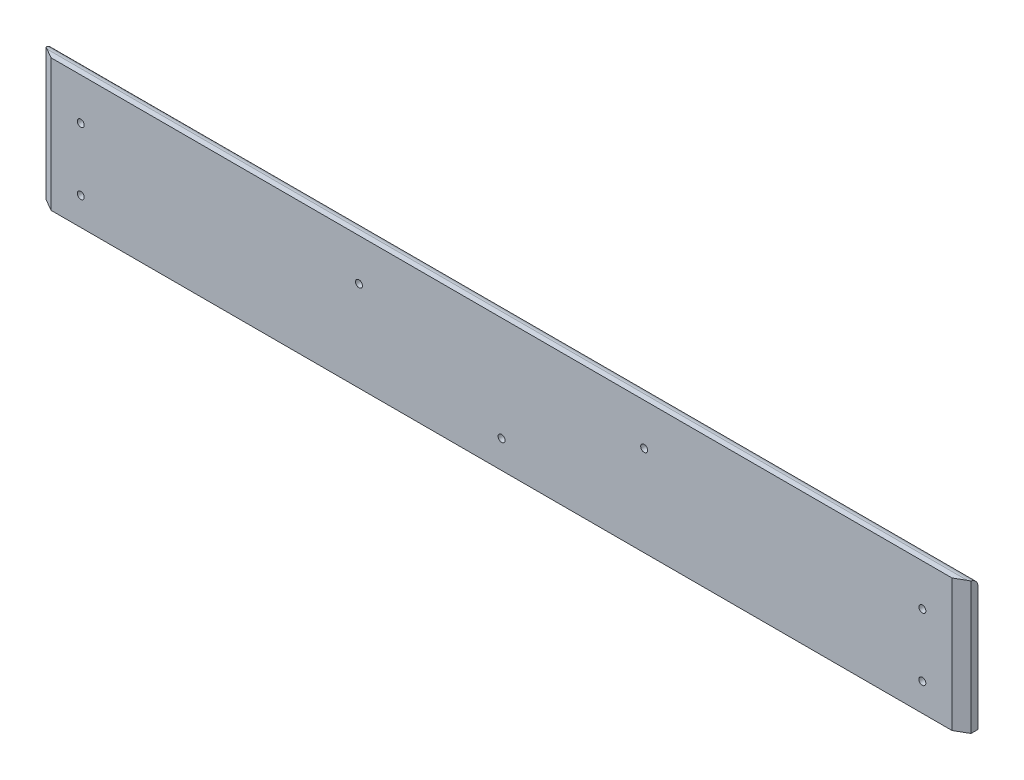
ISO-10303-21;
HEADER;
FILE_DESCRIPTION(('STEP AP214'),'2;1');
FILE_NAME('part.step','',(''),(''),'','','');
FILE_SCHEMA(('AUTOMOTIVE_DESIGN { 1 0 10303 214 1 1 1 1 }'));
ENDSEC;
DATA;
#1=APPLICATION_CONTEXT('core data for automotive mechanical design processes');
#2=APPLICATION_PROTOCOL_DEFINITION('international standard','automotive_design',2000,#1);
#3=PRODUCT_CONTEXT('',#1,'mechanical');
#4=PRODUCT('Part','Part','',(#3));
#5=PRODUCT_RELATED_PRODUCT_CATEGORY('part','',(#4));
#6=PRODUCT_DEFINITION_FORMATION('','',#4);
#7=PRODUCT_DEFINITION_CONTEXT('part definition',#1,'design');
#8=PRODUCT_DEFINITION('design','',#6,#7);
#9=PRODUCT_DEFINITION_SHAPE('','',#8);
#10=(LENGTH_UNIT() NAMED_UNIT(*) SI_UNIT(.MILLI.,.METRE.));
#11=(NAMED_UNIT(*) PLANE_ANGLE_UNIT() SI_UNIT($,.RADIAN.));
#12=(NAMED_UNIT(*) SI_UNIT($,.STERADIAN.) SOLID_ANGLE_UNIT());
#13=UNCERTAINTY_MEASURE_WITH_UNIT(LENGTH_MEASURE(1.E-05),#10,'distance_accuracy_value','');
#14=(GEOMETRIC_REPRESENTATION_CONTEXT(3) GLOBAL_UNCERTAINTY_ASSIGNED_CONTEXT((#13)) GLOBAL_UNIT_ASSIGNED_CONTEXT((#10,
#11,#12)) REPRESENTATION_CONTEXT('',''));
#15=CARTESIAN_POINT('',(0.,0.,0.));
#16=DIRECTION('',(0.,0.,1.));
#17=DIRECTION('',(1.,0.,0.));
#18=AXIS2_PLACEMENT_3D('',#15,#16,#17);
#19=CARTESIAN_POINT('',(332.5,-47.4999999999999,5.));
#20=DIRECTION('',(-1.,0.,0.));
#21=DIRECTION('',(0.,0.,1.));
#22=AXIS2_PLACEMENT_3D('',#19,#20,#21);
#23=PLANE('',#22);
#24=CARTESIAN_POINT('',(332.5,41.4999999999999,1.));
#25=DIRECTION('',(-1.,0.,0.));
#26=DIRECTION('',(0.,0.,1.));
#27=AXIS2_PLACEMENT_3D('',#24,#25,#26);
#28=CIRCLE('',#27,6.);
#29=CARTESIAN_POINT('',(332.5,41.4999999999999,-5.));
#30=VERTEX_POINT('',#29);
#31=CARTESIAN_POINT('',(332.5,47.4160797830995,0.));
#32=VERTEX_POINT('',#31);
#33=EDGE_CURVE('E156',#30,#32,#28,.F.);
#34=ORIENTED_EDGE('',*,*,#33,.T.);
#35=DIRECTION('',(0.,-1.,0.));
#36=VECTOR('',#35,1.);
#37=CARTESIAN_POINT('',(332.5,-47.4999999999999,0.));
#38=LINE('',#37,#36);
#39=CARTESIAN_POINT('',(332.5,-47.4999999999999,0.));
#40=VERTEX_POINT('',#39);
#41=EDGE_CURVE('E77',#32,#40,#38,.T.);
#42=ORIENTED_EDGE('',*,*,#41,.T.);
#43=DIRECTION('',(0.,0.,-1.));
#44=VECTOR('',#43,1.);
#45=CARTESIAN_POINT('',(332.5,-47.4999999999999,5.));
#46=LINE('',#45,#44);
#47=CARTESIAN_POINT('',(332.5,-47.4999999999999,-5.));
#48=VERTEX_POINT('',#47);
#49=EDGE_CURVE('E122',#40,#48,#46,.T.);
#50=ORIENTED_EDGE('',*,*,#49,.T.);
#51=DIRECTION('',(0.,1.,0.));
#52=VECTOR('',#51,1.);
#53=CARTESIAN_POINT('',(332.5,-47.4999999999999,-5.));
#54=LINE('',#53,#52);
#55=EDGE_CURVE('E132',#48,#30,#54,.T.);
#56=ORIENTED_EDGE('',*,*,#55,.T.);
#57=EDGE_LOOP('',(#34,#42,#50,#56));
#58=FACE_BOUND('',#57,.T.);
#59=ADVANCED_FACE('F52',(#58),#23,.F.);
#60=CARTESIAN_POINT('',(-332.5,47.4999999999998,5.));
#61=DIRECTION('',(0.,-1.,0.));
#62=DIRECTION('',(1.,0.,0.));
#63=AXIS2_PLACEMENT_3D('',#60,#61,#62);
#64=PLANE('',#63);
#65=DIRECTION('',(-1.,0.,0.));
#66=VECTOR('',#65,1.);
#67=CARTESIAN_POINT('',(-332.5,47.4999999999998,5.));
#68=LINE('',#67,#66);
#69=CARTESIAN_POINT('',(323.839745962156,47.4999999999999,5.));
#70=VERTEX_POINT('',#69);
#71=CARTESIAN_POINT('',(-323.839745962156,47.4999999999998,5.));
#72=VERTEX_POINT('',#71);
#73=EDGE_CURVE('E137',#70,#72,#68,.T.);
#74=ORIENTED_EDGE('',*,*,#73,.F.);
#75=DIRECTION('',(-0.866025403784439,0.,0.499999999999999));
#76=VECTOR('',#75,1.);
#77=CARTESIAN_POINT('',(323.839745962156,47.4999999999999,5.));
#78=LINE('',#77,#76);
#79=CARTESIAN_POINT('',(330.767949192431,47.4999999999999,1.));
#80=VERTEX_POINT('',#79);
#81=EDGE_CURVE('E170',#70,#80,#78,.F.);
#82=ORIENTED_EDGE('',*,*,#81,.T.);
#83=DIRECTION('',(-1.,0.,0.));
#84=VECTOR('',#83,1.);
#85=CARTESIAN_POINT('',(-332.5,47.4999999999998,1.));
#86=LINE('',#85,#84);
#87=CARTESIAN_POINT('',(-330.767949192431,47.4999999999998,1.));
#88=VERTEX_POINT('',#87);
#89=EDGE_CURVE('E121',#80,#88,#86,.T.);
#90=ORIENTED_EDGE('',*,*,#89,.T.);
#91=DIRECTION('',(-0.866025403784439,0.,-0.499999999999999));
#92=VECTOR('',#91,1.);
#93=CARTESIAN_POINT('',(-323.839745962156,47.4999999999998,5.));
#94=LINE('',#93,#92);
#95=EDGE_CURVE('E167',#88,#72,#94,.F.);
#96=ORIENTED_EDGE('',*,*,#95,.T.);
#97=EDGE_LOOP('',(#74,#82,#90,#96));
#98=FACE_BOUND('',#97,.T.);
#99=ADVANCED_FACE('F264',(#98),#64,.F.);
#100=CARTESIAN_POINT('',(-332.5,-47.5,5.));
#101=DIRECTION('',(1.,0.,0.));
#102=DIRECTION('',(0.,0.,-1.));
#103=AXIS2_PLACEMENT_3D('',#100,#101,#102);
#104=PLANE('',#103);
#105=DIRECTION('',(0.,0.,-1.));
#106=VECTOR('',#105,1.);
#107=CARTESIAN_POINT('',(-332.5,-47.5,5.));
#108=LINE('',#107,#106);
#109=CARTESIAN_POINT('',(-332.5,-47.5,0.));
#110=VERTEX_POINT('',#109);
#111=CARTESIAN_POINT('',(-332.5,-47.5,-5.));
#112=VERTEX_POINT('',#111);
#113=EDGE_CURVE('E112',#110,#112,#108,.T.);
#114=ORIENTED_EDGE('',*,*,#113,.F.);
#115=DIRECTION('',(0.,1.,0.));
#116=VECTOR('',#115,1.);
#117=CARTESIAN_POINT('',(-332.5,-47.5,0.));
#118=LINE('',#117,#116);
#119=CARTESIAN_POINT('',(-332.5,47.4160797830995,0.));
#120=VERTEX_POINT('',#119);
#121=EDGE_CURVE('E186',#110,#120,#118,.T.);
#122=ORIENTED_EDGE('',*,*,#121,.T.);
#123=CARTESIAN_POINT('',(-332.5,41.4999999999998,1.));
#124=DIRECTION('',(1.,0.,0.));
#125=DIRECTION('',(0.,0.,-1.));
#126=AXIS2_PLACEMENT_3D('',#123,#124,#125);
#127=CIRCLE('',#126,6.);
#128=CARTESIAN_POINT('',(-332.5,41.4999999999998,-5.));
#129=VERTEX_POINT('',#128);
#130=EDGE_CURVE('E128',#120,#129,#127,.F.);
#131=ORIENTED_EDGE('',*,*,#130,.T.);
#132=DIRECTION('',(0.,-1.,0.));
#133=VECTOR('',#132,1.);
#134=CARTESIAN_POINT('',(-332.5,-47.5,-5.));
#135=LINE('',#134,#133);
#136=EDGE_CURVE('E125',#129,#112,#135,.T.);
#137=ORIENTED_EDGE('',*,*,#136,.T.);
#138=EDGE_LOOP('',(#114,#122,#131,#137));
#139=FACE_BOUND('',#138,.T.);
#140=ADVANCED_FACE('F126',(#139),#104,.F.);
#141=CARTESIAN_POINT('',(-332.5,-47.5,5.));
#142=DIRECTION('',(0.,1.,0.));
#143=DIRECTION('',(-1.,0.,0.));
#144=AXIS2_PLACEMENT_3D('',#141,#142,#143);
#145=PLANE('',#144);
#146=ORIENTED_EDGE('',*,*,#49,.F.);
#147=DIRECTION('',(0.866025403784439,0.,-0.499999999999999));
#148=VECTOR('',#147,1.);
#149=CARTESIAN_POINT('',(323.839745962156,-47.4999999999999,5.));
#150=LINE('',#149,#148);
#151=CARTESIAN_POINT('',(323.839745962156,-47.4999999999999,5.));
#152=VERTEX_POINT('',#151);
#153=EDGE_CURVE('E183',#40,#152,#150,.F.);
#154=ORIENTED_EDGE('',*,*,#153,.T.);
#155=DIRECTION('',(1.,0.,0.));
#156=VECTOR('',#155,1.);
#157=CARTESIAN_POINT('',(-332.5,-47.5,5.));
#158=LINE('',#157,#156);
#159=CARTESIAN_POINT('',(-323.839745962156,-47.5,5.));
#160=VERTEX_POINT('',#159);
#161=EDGE_CURVE('E142',#160,#152,#158,.T.);
#162=ORIENTED_EDGE('',*,*,#161,.F.);
#163=DIRECTION('',(0.866025403784439,0.,0.499999999999999));
#164=VECTOR('',#163,1.);
#165=CARTESIAN_POINT('',(-323.839745962156,-47.5,5.));
#166=LINE('',#165,#164);
#167=EDGE_CURVE('E69',#160,#110,#166,.F.);
#168=ORIENTED_EDGE('',*,*,#167,.T.);
#169=ORIENTED_EDGE('',*,*,#113,.T.);
#170=DIRECTION('',(1.,0.,0.));
#171=VECTOR('',#170,1.);
#172=CARTESIAN_POINT('',(-332.5,-47.5,-5.));
#173=LINE('',#172,#171);
#174=EDGE_CURVE('E116',#112,#48,#173,.T.);
#175=ORIENTED_EDGE('',*,*,#174,.T.);
#176=EDGE_LOOP('',(#146,#154,#162,#168,#169,#175));
#177=FACE_BOUND('',#176,.T.);
#178=ADVANCED_FACE('F114',(#177),#145,.F.);
#179=CARTESIAN_POINT('',(0.,0.,5.));
#180=DIRECTION('',(0.,0.,-1.));
#181=DIRECTION('',(-1.,0.,0.));
#182=AXIS2_PLACEMENT_3D('',#179,#180,#181);
#183=PLANE('',#182);
#184=CARTESIAN_POINT('',(0.,-27.5,5.));
#185=DIRECTION('',(0.,0.,1.));
#186=DIRECTION('',(1.,0.,0.));
#187=AXIS2_PLACEMENT_3D('',#184,#185,#186);
#188=CIRCLE('',#187,2.5);
#189=CARTESIAN_POINT('',(2.5,-27.5,5.));
#190=VERTEX_POINT('',#189);
#191=EDGE_CURVE('E355',#190,#190,#188,.T.);
#192=ORIENTED_EDGE('',*,*,#191,.F.);
#193=EDGE_LOOP('',(#192));
#194=FACE_BOUND('',#193,.T.);
#195=CARTESIAN_POINT('',(302.5,-27.5,5.));
#196=DIRECTION('',(0.,0.,1.));
#197=DIRECTION('',(1.,0.,0.));
#198=AXIS2_PLACEMENT_3D('',#195,#196,#197);
#199=CIRCLE('',#198,2.50000000000002);
#200=CARTESIAN_POINT('',(305.,-27.5,5.));
#201=VERTEX_POINT('',#200);
#202=EDGE_CURVE('E360',#201,#201,#199,.T.);
#203=ORIENTED_EDGE('',*,*,#202,.F.);
#204=EDGE_LOOP('',(#203));
#205=FACE_BOUND('',#204,.T.);
#206=CARTESIAN_POINT('',(-302.5,17.5,5.));
#207=DIRECTION('',(0.,0.,1.));
#208=DIRECTION('',(1.,0.,0.));
#209=AXIS2_PLACEMENT_3D('',#206,#207,#208);
#210=CIRCLE('',#209,2.50000000000002);
#211=CARTESIAN_POINT('',(-300.,17.5,5.));
#212=VERTEX_POINT('',#211);
#213=EDGE_CURVE('E364',#212,#212,#210,.T.);
#214=ORIENTED_EDGE('',*,*,#213,.F.);
#215=EDGE_LOOP('',(#214));
#216=FACE_BOUND('',#215,.T.);
#217=CARTESIAN_POINT('',(302.5,17.5,5.));
#218=DIRECTION('',(0.,0.,1.));
#219=DIRECTION('',(1.,0.,0.));
#220=AXIS2_PLACEMENT_3D('',#217,#218,#219);
#221=CIRCLE('',#220,2.50000000000002);
#222=CARTESIAN_POINT('',(305.,17.5,5.));
#223=VERTEX_POINT('',#222);
#224=EDGE_CURVE('E352',#223,#223,#221,.T.);
#225=ORIENTED_EDGE('',*,*,#224,.F.);
#226=EDGE_LOOP('',(#225));
#227=FACE_BOUND('',#226,.T.);
#228=CARTESIAN_POINT('',(-102.5,17.5,5.));
#229=DIRECTION('',(0.,0.,1.));
#230=DIRECTION('',(1.,0.,0.));
#231=AXIS2_PLACEMENT_3D('',#228,#229,#230);
#232=CIRCLE('',#231,2.50000000000002);
#233=CARTESIAN_POINT('',(-99.9999999999999,17.5,5.));
#234=VERTEX_POINT('',#233);
#235=EDGE_CURVE('E347',#234,#234,#232,.T.);
#236=ORIENTED_EDGE('',*,*,#235,.F.);
#237=EDGE_LOOP('',(#236));
#238=FACE_BOUND('',#237,.T.);
#239=CARTESIAN_POINT('',(102.5,17.5,5.));
#240=DIRECTION('',(0.,0.,1.));
#241=DIRECTION('',(1.,0.,0.));
#242=AXIS2_PLACEMENT_3D('',#239,#240,#241);
#243=CIRCLE('',#242,2.50000000000001);
#244=CARTESIAN_POINT('',(105.,17.5,5.));
#245=VERTEX_POINT('',#244);
#246=EDGE_CURVE('E344',#245,#245,#243,.T.);
#247=ORIENTED_EDGE('',*,*,#246,.F.);
#248=EDGE_LOOP('',(#247));
#249=FACE_BOUND('',#248,.T.);
#250=CARTESIAN_POINT('',(-302.5,-27.5,5.));
#251=DIRECTION('',(0.,0.,1.));
#252=DIRECTION('',(1.,0.,0.));
#253=AXIS2_PLACEMENT_3D('',#250,#251,#252);
#254=CIRCLE('',#253,2.50000000000002);
#255=CARTESIAN_POINT('',(-300.,-27.5,5.));
#256=VERTEX_POINT('',#255);
#257=EDGE_CURVE('E359',#256,#256,#254,.T.);
#258=ORIENTED_EDGE('',*,*,#257,.F.);
#259=EDGE_LOOP('',(#258));
#260=FACE_BOUND('',#259,.T.);
#261=ORIENTED_EDGE('',*,*,#161,.T.);
#262=DIRECTION('',(0.,1.,0.));
#263=VECTOR('',#262,1.);
#264=CARTESIAN_POINT('',(323.839745962156,0.,5.));
#265=LINE('',#264,#263);
#266=EDGE_CURVE('E163',#152,#70,#265,.T.);
#267=ORIENTED_EDGE('',*,*,#266,.T.);
#268=ORIENTED_EDGE('',*,*,#73,.T.);
#269=DIRECTION('',(0.,-1.,0.));
#270=VECTOR('',#269,1.);
#271=CARTESIAN_POINT('',(-323.839745962156,0.,5.));
#272=LINE('',#271,#270);
#273=EDGE_CURVE('E159',#72,#160,#272,.T.);
#274=ORIENTED_EDGE('',*,*,#273,.T.);
#275=EDGE_LOOP('',(#261,#267,#268,#274));
#276=FACE_BOUND('',#275,.T.);
#277=ADVANCED_FACE('F253',(#194,#205,#216,#227,#238,#249,#260,#276),#183,.F.);
#278=CARTESIAN_POINT('',(0.,0.,-5.));
#279=DIRECTION('',(0.,0.,-1.));
#280=DIRECTION('',(-1.,0.,0.));
#281=AXIS2_PLACEMENT_3D('',#278,#279,#280);
#282=PLANE('',#281);
#283=CARTESIAN_POINT('',(-302.5,-27.5,-5.));
#284=DIRECTION('',(0.,0.,-1.));
#285=DIRECTION('',(-1.,0.,0.));
#286=AXIS2_PLACEMENT_3D('',#283,#284,#285);
#287=CIRCLE('',#286,4.49999999999995);
#288=CARTESIAN_POINT('',(-307.,-27.5,-5.));
#289=VERTEX_POINT('',#288);
#290=EDGE_CURVE('E213',#289,#289,#287,.F.);
#291=ORIENTED_EDGE('',*,*,#290,.T.);
#292=EDGE_LOOP('',(#291));
#293=FACE_BOUND('',#292,.T.);
#294=CARTESIAN_POINT('',(-302.5,17.5,-5.));
#295=DIRECTION('',(0.,0.,-1.));
#296=DIRECTION('',(-1.,0.,0.));
#297=AXIS2_PLACEMENT_3D('',#294,#295,#296);
#298=CIRCLE('',#297,4.49999999999995);
#299=CARTESIAN_POINT('',(-307.,17.5,-5.));
#300=VERTEX_POINT('',#299);
#301=EDGE_CURVE('E209',#300,#300,#298,.F.);
#302=ORIENTED_EDGE('',*,*,#301,.T.);
#303=EDGE_LOOP('',(#302));
#304=FACE_BOUND('',#303,.T.);
#305=CARTESIAN_POINT('',(-102.5,17.5,-5.));
#306=DIRECTION('',(0.,0.,-1.));
#307=DIRECTION('',(-1.,0.,0.));
#308=AXIS2_PLACEMENT_3D('',#305,#306,#307);
#309=CIRCLE('',#308,4.50000000000006);
#310=CARTESIAN_POINT('',(-107.,17.5,-5.));
#311=VERTEX_POINT('',#310);
#312=EDGE_CURVE('E205',#311,#311,#309,.F.);
#313=ORIENTED_EDGE('',*,*,#312,.T.);
#314=EDGE_LOOP('',(#313));
#315=FACE_BOUND('',#314,.T.);
#316=CARTESIAN_POINT('',(0.,-27.5,-5.));
#317=DIRECTION('',(0.,0.,-1.));
#318=DIRECTION('',(-1.,0.,0.));
#319=AXIS2_PLACEMENT_3D('',#316,#317,#318);
#320=CIRCLE('',#319,4.49999999999995);
#321=CARTESIAN_POINT('',(-4.49999999999995,-27.5,-5.));
#322=VERTEX_POINT('',#321);
#323=EDGE_CURVE('E201',#322,#322,#320,.F.);
#324=ORIENTED_EDGE('',*,*,#323,.T.);
#325=EDGE_LOOP('',(#324));
#326=FACE_BOUND('',#325,.T.);
#327=CARTESIAN_POINT('',(102.5,17.5,-5.));
#328=DIRECTION('',(0.,0.,-1.));
#329=DIRECTION('',(-1.,0.,0.));
#330=AXIS2_PLACEMENT_3D('',#327,#328,#329);
#331=CIRCLE('',#330,4.50000000000006);
#332=CARTESIAN_POINT('',(97.9999999999999,17.5,-5.));
#333=VERTEX_POINT('',#332);
#334=EDGE_CURVE('E197',#333,#333,#331,.F.);
#335=ORIENTED_EDGE('',*,*,#334,.T.);
#336=EDGE_LOOP('',(#335));
#337=FACE_BOUND('',#336,.T.);
#338=CARTESIAN_POINT('',(302.5,-27.5,-5.));
#339=DIRECTION('',(0.,0.,-1.));
#340=DIRECTION('',(-1.,0.,0.));
#341=AXIS2_PLACEMENT_3D('',#338,#339,#340);
#342=CIRCLE('',#341,4.49999999999995);
#343=CARTESIAN_POINT('',(298.,-27.5,-5.));
#344=VERTEX_POINT('',#343);
#345=EDGE_CURVE('E193',#344,#344,#342,.F.);
#346=ORIENTED_EDGE('',*,*,#345,.T.);
#347=EDGE_LOOP('',(#346));
#348=FACE_BOUND('',#347,.T.);
#349=CARTESIAN_POINT('',(302.5,17.5,-5.));
#350=DIRECTION('',(0.,0.,-1.));
#351=DIRECTION('',(-1.,0.,0.));
#352=AXIS2_PLACEMENT_3D('',#349,#350,#351);
#353=CIRCLE('',#352,4.49999999999995);
#354=CARTESIAN_POINT('',(298.,17.5,-5.));
#355=VERTEX_POINT('',#354);
#356=EDGE_CURVE('E189',#355,#355,#353,.F.);
#357=ORIENTED_EDGE('',*,*,#356,.T.);
#358=EDGE_LOOP('',(#357));
#359=FACE_BOUND('',#358,.T.);
#360=ORIENTED_EDGE('',*,*,#136,.F.);
#361=DIRECTION('',(-1.,0.,0.));
#362=VECTOR('',#361,1.);
#363=CARTESIAN_POINT('',(332.5,41.4999999999999,-5.));
#364=LINE('',#363,#362);
#365=EDGE_CURVE('E153',#129,#30,#364,.F.);
#366=ORIENTED_EDGE('',*,*,#365,.T.);
#367=ORIENTED_EDGE('',*,*,#55,.F.);
#368=ORIENTED_EDGE('',*,*,#174,.F.);
#369=EDGE_LOOP('',(#360,#366,#367,#368));
#370=FACE_BOUND('',#369,.T.);
#371=ADVANCED_FACE('F134',(#293,#304,#315,#326,#337,#348,#359,#370),#282,.T.);
#372=CARTESIAN_POINT('',(-332.5,41.4999999999998,1.));
#373=DIRECTION('',(1.,0.,0.));
#374=DIRECTION('',(0.,1.,0.));
#375=AXIS2_PLACEMENT_3D('',#372,#373,#374);
#376=CYLINDRICAL_SURFACE('',#375,6.);
#377=ORIENTED_EDGE('',*,*,#89,.F.);
#378=CARTESIAN_POINT('',(330.767949192431,41.4999999999999,1.));
#379=DIRECTION('',(-0.499999999999999,0.,-0.866025403784439));
#380=DIRECTION('',(0.866025403784439,0.,-0.499999999999999));
#381=AXIS2_PLACEMENT_3D('',#378,#379,#380);
#382=ELLIPSE('',#381,12.,6.);
#383=EDGE_CURVE('E176',#80,#32,#382,.T.);
#384=ORIENTED_EDGE('',*,*,#383,.T.);
#385=ORIENTED_EDGE('',*,*,#33,.F.);
#386=ORIENTED_EDGE('',*,*,#365,.F.);
#387=ORIENTED_EDGE('',*,*,#130,.F.);
#388=CARTESIAN_POINT('',(-330.767949192431,41.4999999999998,1.));
#389=DIRECTION('',(0.499999999999999,0.,-0.866025403784439));
#390=DIRECTION('',(0.866025403784439,0.,0.499999999999999));
#391=AXIS2_PLACEMENT_3D('',#388,#389,#390);
#392=ELLIPSE('',#391,12.,6.);
#393=EDGE_CURVE('E173',#120,#88,#392,.T.);
#394=ORIENTED_EDGE('',*,*,#393,.T.);
#395=EDGE_LOOP('',(#377,#384,#385,#386,#387,#394));
#396=FACE_BOUND('',#395,.T.);
#397=ADVANCED_FACE('F252',(#396),#376,.T.);
#398=CARTESIAN_POINT('',(323.839745962156,0.,5.));
#399=DIRECTION('',(-0.499999999999999,0.,-0.866025403784439));
#400=DIRECTION('',(0.,1.,0.));
#401=AXIS2_PLACEMENT_3D('',#398,#399,#400);
#402=PLANE('',#401);
#403=ORIENTED_EDGE('',*,*,#153,.F.);
#404=ORIENTED_EDGE('',*,*,#41,.F.);
#405=ORIENTED_EDGE('',*,*,#383,.F.);
#406=ORIENTED_EDGE('',*,*,#81,.F.);
#407=ORIENTED_EDGE('',*,*,#266,.F.);
#408=EDGE_LOOP('',(#403,#404,#405,#406,#407));
#409=FACE_BOUND('',#408,.T.);
#410=ADVANCED_FACE('F275',(#409),#402,.F.);
#411=CARTESIAN_POINT('',(-323.839745962156,0.,5.));
#412=DIRECTION('',(0.499999999999999,0.,-0.866025403784439));
#413=DIRECTION('',(0.,-1.,0.));
#414=AXIS2_PLACEMENT_3D('',#411,#412,#413);
#415=PLANE('',#414);
#416=ORIENTED_EDGE('',*,*,#393,.F.);
#417=ORIENTED_EDGE('',*,*,#121,.F.);
#418=ORIENTED_EDGE('',*,*,#167,.F.);
#419=ORIENTED_EDGE('',*,*,#273,.F.);
#420=ORIENTED_EDGE('',*,*,#95,.F.);
#421=EDGE_LOOP('',(#416,#417,#418,#419,#420));
#422=FACE_BOUND('',#421,.T.);
#423=ADVANCED_FACE('F283',(#422),#415,.F.);
#424=CARTESIAN_POINT('',(-302.5,-27.5,-5.));
#425=DIRECTION('',(0.,0.,1.));
#426=DIRECTION('',(1.,0.,0.));
#427=AXIS2_PLACEMENT_3D('',#424,#425,#426);
#428=CYLINDRICAL_SURFACE('',#427,2.50000000000002);
#429=CARTESIAN_POINT('',(-302.5,-27.5,-3.00000000000012));
#430=DIRECTION('',(0.,0.,-1.));
#431=DIRECTION('',(-1.,0.,0.));
#432=AXIS2_PLACEMENT_3D('',#429,#430,#431);
#433=CIRCLE('',#432,2.50000000000002);
#434=CARTESIAN_POINT('',(-305.,-27.5,-3.00000000000012));
#435=VERTEX_POINT('',#434);
#436=EDGE_CURVE('E217',#435,#435,#433,.T.);
#437=ORIENTED_EDGE('',*,*,#436,.T.);
#438=EDGE_LOOP('',(#437));
#439=FACE_BOUND('',#438,.T.);
#440=ORIENTED_EDGE('',*,*,#257,.T.);
#441=EDGE_LOOP('',(#440));
#442=FACE_BOUND('',#441,.T.);
#443=ADVANCED_FACE('F290',(#439,#442),#428,.F.);
#444=CARTESIAN_POINT('',(102.5,17.5,-5.));
#445=DIRECTION('',(0.,0.,1.));
#446=DIRECTION('',(1.,0.,0.));
#447=AXIS2_PLACEMENT_3D('',#444,#445,#446);
#448=CYLINDRICAL_SURFACE('',#447,2.50000000000001);
#449=CARTESIAN_POINT('',(102.5,17.5,-2.99999999999992));
#450=DIRECTION('',(0.,0.,-1.));
#451=DIRECTION('',(-1.,0.,0.));
#452=AXIS2_PLACEMENT_3D('',#449,#450,#451);
#453=CIRCLE('',#452,2.50000000000001);
#454=CARTESIAN_POINT('',(100.,17.5,-2.99999999999992));
#455=VERTEX_POINT('',#454);
#456=EDGE_CURVE('E233',#455,#455,#453,.T.);
#457=ORIENTED_EDGE('',*,*,#456,.T.);
#458=EDGE_LOOP('',(#457));
#459=FACE_BOUND('',#458,.T.);
#460=ORIENTED_EDGE('',*,*,#246,.T.);
#461=EDGE_LOOP('',(#460));
#462=FACE_BOUND('',#461,.T.);
#463=ADVANCED_FACE('F337',(#459,#462),#448,.F.);
#464=CARTESIAN_POINT('',(-102.5,17.5,-5.));
#465=DIRECTION('',(0.,0.,1.));
#466=DIRECTION('',(1.,0.,0.));
#467=AXIS2_PLACEMENT_3D('',#464,#465,#466);
#468=CYLINDRICAL_SURFACE('',#467,2.50000000000002);
#469=CARTESIAN_POINT('',(-102.5,17.5,-2.99999999999994));
#470=DIRECTION('',(0.,0.,-1.));
#471=DIRECTION('',(-1.,0.,0.));
#472=AXIS2_PLACEMENT_3D('',#469,#470,#471);
#473=CIRCLE('',#472,2.50000000000002);
#474=CARTESIAN_POINT('',(-105.,17.5,-2.99999999999994));
#475=VERTEX_POINT('',#474);
#476=EDGE_CURVE('E225',#475,#475,#473,.T.);
#477=ORIENTED_EDGE('',*,*,#476,.T.);
#478=EDGE_LOOP('',(#477));
#479=FACE_BOUND('',#478,.T.);
#480=ORIENTED_EDGE('',*,*,#235,.T.);
#481=EDGE_LOOP('',(#480));
#482=FACE_BOUND('',#481,.T.);
#483=ADVANCED_FACE('F340',(#479,#482),#468,.F.);
#484=CARTESIAN_POINT('',(302.5,17.5,-5.));
#485=DIRECTION('',(0.,0.,1.));
#486=DIRECTION('',(1.,0.,0.));
#487=AXIS2_PLACEMENT_3D('',#484,#485,#486);
#488=CYLINDRICAL_SURFACE('',#487,2.50000000000002);
#489=CARTESIAN_POINT('',(302.5,17.5,-3.00000000000012));
#490=DIRECTION('',(0.,0.,-1.));
#491=DIRECTION('',(-1.,0.,0.));
#492=AXIS2_PLACEMENT_3D('',#489,#490,#491);
#493=CIRCLE('',#492,2.50000000000002);
#494=CARTESIAN_POINT('',(300.,17.5,-3.00000000000012));
#495=VERTEX_POINT('',#494);
#496=EDGE_CURVE('E13',#495,#495,#493,.T.);
#497=ORIENTED_EDGE('',*,*,#496,.T.);
#498=EDGE_LOOP('',(#497));
#499=FACE_BOUND('',#498,.T.);
#500=ORIENTED_EDGE('',*,*,#224,.T.);
#501=EDGE_LOOP('',(#500));
#502=FACE_BOUND('',#501,.T.);
#503=ADVANCED_FACE('F459',(#499,#502),#488,.F.);
#504=CARTESIAN_POINT('',(-302.5,17.5,-5.));
#505=DIRECTION('',(0.,0.,1.));
#506=DIRECTION('',(1.,0.,0.));
#507=AXIS2_PLACEMENT_3D('',#504,#505,#506);
#508=CYLINDRICAL_SURFACE('',#507,2.50000000000002);
#509=CARTESIAN_POINT('',(-302.5,17.5,-3.00000000000012));
#510=DIRECTION('',(0.,0.,-1.));
#511=DIRECTION('',(-1.,0.,0.));
#512=AXIS2_PLACEMENT_3D('',#509,#510,#511);
#513=CIRCLE('',#512,2.50000000000002);
#514=CARTESIAN_POINT('',(-305.,17.5,-3.00000000000012));
#515=VERTEX_POINT('',#514);
#516=EDGE_CURVE('E221',#515,#515,#513,.T.);
#517=ORIENTED_EDGE('',*,*,#516,.T.);
#518=EDGE_LOOP('',(#517));
#519=FACE_BOUND('',#518,.T.);
#520=ORIENTED_EDGE('',*,*,#213,.T.);
#521=EDGE_LOOP('',(#520));
#522=FACE_BOUND('',#521,.T.);
#523=ADVANCED_FACE('F469',(#519,#522),#508,.F.);
#524=CARTESIAN_POINT('',(302.5,-27.5,-5.));
#525=DIRECTION('',(0.,0.,1.));
#526=DIRECTION('',(1.,0.,0.));
#527=AXIS2_PLACEMENT_3D('',#524,#525,#526);
#528=CYLINDRICAL_SURFACE('',#527,2.50000000000002);
#529=CARTESIAN_POINT('',(302.5,-27.5,-3.00000000000012));
#530=DIRECTION('',(0.,0.,-1.));
#531=DIRECTION('',(-1.,0.,0.));
#532=AXIS2_PLACEMENT_3D('',#529,#530,#531);
#533=CIRCLE('',#532,2.50000000000002);
#534=CARTESIAN_POINT('',(300.,-27.5,-3.00000000000012));
#535=VERTEX_POINT('',#534);
#536=EDGE_CURVE('E62',#535,#535,#533,.T.);
#537=ORIENTED_EDGE('',*,*,#536,.T.);
#538=EDGE_LOOP('',(#537));
#539=FACE_BOUND('',#538,.T.);
#540=ORIENTED_EDGE('',*,*,#202,.T.);
#541=EDGE_LOOP('',(#540));
#542=FACE_BOUND('',#541,.T.);
#543=ADVANCED_FACE('F241',(#539,#542),#528,.F.);
#544=CARTESIAN_POINT('',(0.,-27.5,-5.));
#545=DIRECTION('',(0.,0.,1.));
#546=DIRECTION('',(1.,0.,0.));
#547=AXIS2_PLACEMENT_3D('',#544,#545,#546);
#548=CYLINDRICAL_SURFACE('',#547,2.5);
#549=CARTESIAN_POINT('',(0.,-27.5,-3.));
#550=DIRECTION('',(0.,0.,-1.));
#551=DIRECTION('',(-1.,0.,0.));
#552=AXIS2_PLACEMENT_3D('',#549,#550,#551);
#553=CIRCLE('',#552,2.5);
#554=CARTESIAN_POINT('',(-2.5,-27.5,-3.));
#555=VERTEX_POINT('',#554);
#556=EDGE_CURVE('E229',#555,#555,#553,.T.);
#557=ORIENTED_EDGE('',*,*,#556,.T.);
#558=EDGE_LOOP('',(#557));
#559=FACE_BOUND('',#558,.T.);
#560=ORIENTED_EDGE('',*,*,#191,.T.);
#561=EDGE_LOOP('',(#560));
#562=FACE_BOUND('',#561,.T.);
#563=ADVANCED_FACE('F299',(#559,#562),#548,.F.);
#564=CARTESIAN_POINT('',(-302.5,-27.5,-5.));
#565=DIRECTION('',(0.,0.,-1.));
#566=DIRECTION('',(-1.,0.,0.));
#567=AXIS2_PLACEMENT_3D('',#564,#565,#566);
#568=CONICAL_SURFACE('',#567,4.49999999999995,0.78539816339746);
#569=ORIENTED_EDGE('',*,*,#436,.F.);
#570=EDGE_LOOP('',(#569));
#571=FACE_BOUND('',#570,.T.);
#572=ORIENTED_EDGE('',*,*,#290,.F.);
#573=EDGE_LOOP('',(#572));
#574=FACE_BOUND('',#573,.T.);
#575=ADVANCED_FACE('F292',(#571,#574),#568,.F.);
#576=CARTESIAN_POINT('',(-302.5,17.5,-5.));
#577=DIRECTION('',(0.,0.,-1.));
#578=DIRECTION('',(-1.,0.,0.));
#579=AXIS2_PLACEMENT_3D('',#576,#577,#578);
#580=CONICAL_SURFACE('',#579,4.49999999999995,0.78539816339746);
#581=ORIENTED_EDGE('',*,*,#516,.F.);
#582=EDGE_LOOP('',(#581));
#583=FACE_BOUND('',#582,.T.);
#584=ORIENTED_EDGE('',*,*,#301,.F.);
#585=EDGE_LOOP('',(#584));
#586=FACE_BOUND('',#585,.T.);
#587=ADVANCED_FACE('F298',(#583,#586),#580,.F.);
#588=CARTESIAN_POINT('',(-102.5,17.5,-5.));
#589=DIRECTION('',(0.,0.,-1.));
#590=DIRECTION('',(-1.,0.,0.));
#591=AXIS2_PLACEMENT_3D('',#588,#589,#590);
#592=CONICAL_SURFACE('',#591,4.50000000000006,0.785398163397441);
#593=ORIENTED_EDGE('',*,*,#476,.F.);
#594=EDGE_LOOP('',(#593));
#595=FACE_BOUND('',#594,.T.);
#596=ORIENTED_EDGE('',*,*,#312,.F.);
#597=EDGE_LOOP('',(#596));
#598=FACE_BOUND('',#597,.T.);
#599=ADVANCED_FACE('F306',(#595,#598),#592,.F.);
#600=CARTESIAN_POINT('',(0.,-27.5,-5.));
#601=DIRECTION('',(0.,0.,-1.));
#602=DIRECTION('',(-1.,0.,0.));
#603=AXIS2_PLACEMENT_3D('',#600,#601,#602);
#604=CONICAL_SURFACE('',#603,4.49999999999995,0.785398163397437);
#605=ORIENTED_EDGE('',*,*,#556,.F.);
#606=EDGE_LOOP('',(#605));
#607=FACE_BOUND('',#606,.T.);
#608=ORIENTED_EDGE('',*,*,#323,.F.);
#609=EDGE_LOOP('',(#608));
#610=FACE_BOUND('',#609,.T.);
#611=ADVANCED_FACE('F313',(#607,#610),#604,.F.);
#612=CARTESIAN_POINT('',(102.5,17.5,-5.));
#613=DIRECTION('',(0.,0.,-1.));
#614=DIRECTION('',(-1.,0.,0.));
#615=AXIS2_PLACEMENT_3D('',#612,#613,#614);
#616=CONICAL_SURFACE('',#615,4.50000000000006,0.785398163397441);
#617=ORIENTED_EDGE('',*,*,#456,.F.);
#618=EDGE_LOOP('',(#617));
#619=FACE_BOUND('',#618,.T.);
#620=ORIENTED_EDGE('',*,*,#334,.F.);
#621=EDGE_LOOP('',(#620));
#622=FACE_BOUND('',#621,.T.);
#623=ADVANCED_FACE('F247',(#619,#622),#616,.F.);
#624=CARTESIAN_POINT('',(302.5,-27.5,-5.));
#625=DIRECTION('',(0.,0.,-1.));
#626=DIRECTION('',(-1.,0.,0.));
#627=AXIS2_PLACEMENT_3D('',#624,#625,#626);
#628=CONICAL_SURFACE('',#627,4.49999999999995,0.78539816339746);
#629=ORIENTED_EDGE('',*,*,#536,.F.);
#630=EDGE_LOOP('',(#629));
#631=FACE_BOUND('',#630,.T.);
#632=ORIENTED_EDGE('',*,*,#345,.F.);
#633=EDGE_LOOP('',(#632));
#634=FACE_BOUND('',#633,.T.);
#635=ADVANCED_FACE('F244',(#631,#634),#628,.F.);
#636=CARTESIAN_POINT('',(302.5,17.5,-5.));
#637=DIRECTION('',(0.,0.,-1.));
#638=DIRECTION('',(-1.,0.,0.));
#639=AXIS2_PLACEMENT_3D('',#636,#637,#638);
#640=CONICAL_SURFACE('',#639,4.49999999999995,0.78539816339746);
#641=ORIENTED_EDGE('',*,*,#496,.F.);
#642=EDGE_LOOP('',(#641));
#643=FACE_BOUND('',#642,.T.);
#644=ORIENTED_EDGE('',*,*,#356,.F.);
#645=EDGE_LOOP('',(#644));
#646=FACE_BOUND('',#645,.T.);
#647=ADVANCED_FACE('F55',(#643,#646),#640,.F.);
#648=CLOSED_SHELL('',(#59,#99,#140,#178,#277,#371,#397,#410,#423,#443,#463,#483,#503,#523,#543,
#563,#575,#587,#599,#611,#623,#635,#647));
#649=MANIFOLD_SOLID_BREP('B2',#648);
#650=ADVANCED_BREP_SHAPE_REPRESENTATION('',(#18,#649),#14);
#651=SHAPE_DEFINITION_REPRESENTATION(#9,#650);
ENDSEC;
END-ISO-10303-21;
